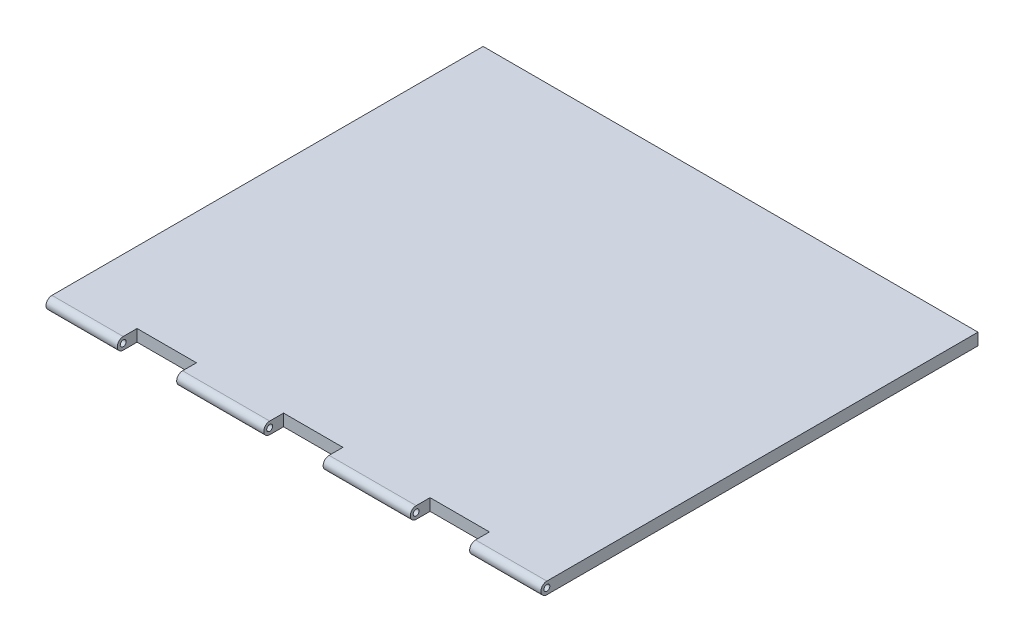
ISO-10303-21;
HEADER;
FILE_DESCRIPTION(('STEP AP214'),'2;1');
FILE_NAME('part.step','',(''),(''),'','','');
FILE_SCHEMA(('AUTOMOTIVE_DESIGN { 1 0 10303 214 1 1 1 1 }'));
ENDSEC;
DATA;
#1=APPLICATION_CONTEXT('core data for automotive mechanical design processes');
#2=APPLICATION_PROTOCOL_DEFINITION('international standard','automotive_design',2000,#1);
#3=PRODUCT_CONTEXT('',#1,'mechanical');
#4=PRODUCT('Part','Part','',(#3));
#5=PRODUCT_RELATED_PRODUCT_CATEGORY('part','',(#4));
#6=PRODUCT_DEFINITION_FORMATION('','',#4);
#7=PRODUCT_DEFINITION_CONTEXT('part definition',#1,'design');
#8=PRODUCT_DEFINITION('design','',#6,#7);
#9=PRODUCT_DEFINITION_SHAPE('','',#8);
#10=(LENGTH_UNIT() NAMED_UNIT(*) SI_UNIT(.MILLI.,.METRE.));
#11=(NAMED_UNIT(*) PLANE_ANGLE_UNIT() SI_UNIT($,.RADIAN.));
#12=(NAMED_UNIT(*) SI_UNIT($,.STERADIAN.) SOLID_ANGLE_UNIT());
#13=UNCERTAINTY_MEASURE_WITH_UNIT(LENGTH_MEASURE(1.E-05),#10,'distance_accuracy_value','');
#14=(GEOMETRIC_REPRESENTATION_CONTEXT(3) GLOBAL_UNCERTAINTY_ASSIGNED_CONTEXT((#13)) GLOBAL_UNIT_ASSIGNED_CONTEXT((#10,
#11,#12)) REPRESENTATION_CONTEXT('',''));
#15=CARTESIAN_POINT('',(0.,0.,0.));
#16=DIRECTION('',(0.,0.,1.));
#17=DIRECTION('',(1.,0.,0.));
#18=AXIS2_PLACEMENT_3D('',#15,#16,#17);
#19=CARTESIAN_POINT('',(-93.9597315436242,3.,-64.3875838926174));
#20=DIRECTION('',(1.,0.,0.));
#21=DIRECTION('',(0.,0.,-1.));
#22=AXIS2_PLACEMENT_3D('',#19,#20,#21);
#23=PLANE('',#22);
#24=CARTESIAN_POINT('',(-93.9597315436242,0.,153.412416107383));
#25=DIRECTION('',(-1.,0.,0.));
#26=DIRECTION('',(0.,0.,1.));
#27=AXIS2_PLACEMENT_3D('',#24,#25,#26);
#28=CIRCLE('',#27,1.5);
#29=CARTESIAN_POINT('',(-93.9597315436242,0.,154.912416107383));
#30=VERTEX_POINT('',#29);
#31=EDGE_CURVE('E329',#30,#30,#28,.T.);
#32=ORIENTED_EDGE('',*,*,#31,.F.);
#33=EDGE_LOOP('',(#32));
#34=FACE_BOUND('',#33,.T.);
#35=DIRECTION('',(0.,0.,1.));
#36=VECTOR('',#35,1.);
#37=CARTESIAN_POINT('',(-93.9597315436242,-3.,-64.3875838926174));
#38=LINE('',#37,#36);
#39=CARTESIAN_POINT('',(-93.9597315436242,-3.,-64.3875838926174));
#40=VERTEX_POINT('',#39);
#41=CARTESIAN_POINT('',(-93.9597315436242,-3.,153.412416107383));
#42=VERTEX_POINT('',#41);
#43=EDGE_CURVE('E216',#40,#42,#38,.T.);
#44=ORIENTED_EDGE('',*,*,#43,.T.);
#45=CARTESIAN_POINT('',(-93.9597315436242,0.,153.412416107383));
#46=DIRECTION('',(-1.,0.,0.));
#47=DIRECTION('',(0.,0.,1.));
#48=AXIS2_PLACEMENT_3D('',#45,#46,#47);
#49=CIRCLE('',#48,3.);
#50=CARTESIAN_POINT('',(-93.9597315436242,3.,153.412416107383));
#51=VERTEX_POINT('',#50);
#52=EDGE_CURVE('E202',#42,#51,#49,.T.);
#53=ORIENTED_EDGE('',*,*,#52,.T.);
#54=DIRECTION('',(0.,0.,1.));
#55=VECTOR('',#54,1.);
#56=CARTESIAN_POINT('',(-93.9597315436242,3.,-64.3875838926174));
#57=LINE('',#56,#55);
#58=CARTESIAN_POINT('',(-93.9597315436242,3.,-64.3875838926174));
#59=VERTEX_POINT('',#58);
#60=EDGE_CURVE('E218',#59,#51,#57,.T.);
#61=ORIENTED_EDGE('',*,*,#60,.F.);
#62=DIRECTION('',(0.,-1.,0.));
#63=VECTOR('',#62,1.);
#64=CARTESIAN_POINT('',(-93.9597315436242,3.,-64.3875838926174));
#65=LINE('',#64,#63);
#66=EDGE_CURVE('E225',#59,#40,#65,.T.);
#67=ORIENTED_EDGE('',*,*,#66,.T.);
#68=EDGE_LOOP('',(#44,#53,#61,#67));
#69=FACE_BOUND('',#68,.T.);
#70=ADVANCED_FACE('F81',(#34,#69),#23,.F.);
#71=CARTESIAN_POINT('',(156.040268456376,3.,-64.3875838926174));
#72=DIRECTION('',(-1.,0.,0.));
#73=DIRECTION('',(0.,0.,1.));
#74=AXIS2_PLACEMENT_3D('',#71,#72,#73);
#75=PLANE('',#74);
#76=CARTESIAN_POINT('',(156.040268456376,0.,153.412416107383));
#77=DIRECTION('',(-1.,0.,0.));
#78=DIRECTION('',(0.,0.,1.));
#79=AXIS2_PLACEMENT_3D('',#76,#77,#78);
#80=CIRCLE('',#79,1.5);
#81=CARTESIAN_POINT('',(156.040268456376,0.,154.912416107383));
#82=VERTEX_POINT('',#81);
#83=EDGE_CURVE('E235',#82,#82,#80,.T.);
#84=ORIENTED_EDGE('',*,*,#83,.T.);
#85=EDGE_LOOP('',(#84));
#86=FACE_BOUND('',#85,.T.);
#87=CARTESIAN_POINT('',(156.040268456376,0.,153.412416107383));
#88=DIRECTION('',(-1.,0.,0.));
#89=DIRECTION('',(0.,0.,1.));
#90=AXIS2_PLACEMENT_3D('',#87,#88,#89);
#91=CIRCLE('',#90,3.);
#92=CARTESIAN_POINT('',(156.040268456376,-3.,153.412416107383));
#93=VERTEX_POINT('',#92);
#94=CARTESIAN_POINT('',(156.040268456376,3.,153.412416107383));
#95=VERTEX_POINT('',#94);
#96=EDGE_CURVE('E193',#93,#95,#91,.T.);
#97=ORIENTED_EDGE('',*,*,#96,.F.);
#98=DIRECTION('',(0.,0.,-1.));
#99=VECTOR('',#98,1.);
#100=CARTESIAN_POINT('',(156.040268456376,-3.,-64.3875838926174));
#101=LINE('',#100,#99);
#102=CARTESIAN_POINT('',(156.040268456376,-3.,-64.3875838926174));
#103=VERTEX_POINT('',#102);
#104=EDGE_CURVE('E198',#93,#103,#101,.T.);
#105=ORIENTED_EDGE('',*,*,#104,.T.);
#106=DIRECTION('',(0.,-1.,0.));
#107=VECTOR('',#106,1.);
#108=CARTESIAN_POINT('',(156.040268456376,3.,-64.3875838926174));
#109=LINE('',#108,#107);
#110=CARTESIAN_POINT('',(156.040268456376,3.,-64.3875838926174));
#111=VERTEX_POINT('',#110);
#112=EDGE_CURVE('E228',#111,#103,#109,.T.);
#113=ORIENTED_EDGE('',*,*,#112,.F.);
#114=DIRECTION('',(0.,0.,-1.));
#115=VECTOR('',#114,1.);
#116=CARTESIAN_POINT('',(156.040268456376,3.,-64.3875838926174));
#117=LINE('',#116,#115);
#118=EDGE_CURVE('E200',#95,#111,#117,.T.);
#119=ORIENTED_EDGE('',*,*,#118,.F.);
#120=EDGE_LOOP('',(#97,#105,#113,#119));
#121=FACE_BOUND('',#120,.T.);
#122=ADVANCED_FACE('F195',(#86,#121),#75,.F.);
#123=CARTESIAN_POINT('',(90.0402684563758,-3.001,156.412416107383));
#124=DIRECTION('',(-1.,0.,0.));
#125=DIRECTION('',(0.,0.,1.));
#126=AXIS2_PLACEMENT_3D('',#123,#124,#125);
#127=PLANE('',#126);
#128=CARTESIAN_POINT('',(90.0402684563758,0.,153.412416107383));
#129=DIRECTION('',(-1.,0.,0.));
#130=DIRECTION('',(0.,0.,1.));
#131=AXIS2_PLACEMENT_3D('',#128,#129,#130);
#132=CIRCLE('',#131,1.5);
#133=CARTESIAN_POINT('',(90.0402684563758,0.,154.912416107383));
#134=VERTEX_POINT('',#133);
#135=EDGE_CURVE('E345',#134,#134,#132,.T.);
#136=ORIENTED_EDGE('',*,*,#135,.T.);
#137=EDGE_LOOP('',(#136));
#138=FACE_BOUND('',#137,.T.);
#139=CARTESIAN_POINT('',(90.0402684563758,0.,153.412416107383));
#140=DIRECTION('',(-1.,0.,0.));
#141=DIRECTION('',(0.,0.,1.));
#142=AXIS2_PLACEMENT_3D('',#139,#140,#141);
#143=CIRCLE('',#142,3.);
#144=CARTESIAN_POINT('',(90.0402684563758,-3.,153.412416107383));
#145=VERTEX_POINT('',#144);
#146=CARTESIAN_POINT('',(90.0402684563758,3.,153.412416107383));
#147=VERTEX_POINT('',#146);
#148=EDGE_CURVE('E299',#145,#147,#143,.T.);
#149=ORIENTED_EDGE('',*,*,#148,.F.);
#150=DIRECTION('',(0.,0.,-1.));
#151=VECTOR('',#150,1.);
#152=CARTESIAN_POINT('',(90.0402684563758,-3.,156.412416107383));
#153=LINE('',#152,#151);
#154=CARTESIAN_POINT('',(90.0402684563758,-3.,146.412416107383));
#155=VERTEX_POINT('',#154);
#156=EDGE_CURVE('E312',#145,#155,#153,.T.);
#157=ORIENTED_EDGE('',*,*,#156,.T.);
#158=DIRECTION('',(0.,1.,0.));
#159=VECTOR('',#158,1.);
#160=CARTESIAN_POINT('',(90.0402684563758,-3.001,146.412416107383));
#161=LINE('',#160,#159);
#162=CARTESIAN_POINT('',(90.0402684563758,3.,146.412416107383));
#163=VERTEX_POINT('',#162);
#164=EDGE_CURVE('E298',#155,#163,#161,.T.);
#165=ORIENTED_EDGE('',*,*,#164,.T.);
#166=DIRECTION('',(0.,0.,1.));
#167=VECTOR('',#166,1.);
#168=CARTESIAN_POINT('',(90.0402684563758,3.,156.412416107383));
#169=LINE('',#168,#167);
#170=EDGE_CURVE('E303',#163,#147,#169,.T.);
#171=ORIENTED_EDGE('',*,*,#170,.T.);
#172=EDGE_LOOP('',(#149,#157,#165,#171));
#173=FACE_BOUND('',#172,.T.);
#174=ADVANCED_FACE('F362',(#138,#173),#127,.F.);
#175=CARTESIAN_POINT('',(120.040268456376,-3.001,156.412416107383));
#176=DIRECTION('',(1.,0.,0.));
#177=DIRECTION('',(0.,0.,-1.));
#178=AXIS2_PLACEMENT_3D('',#175,#176,#177);
#179=PLANE('',#178);
#180=CARTESIAN_POINT('',(120.040268456376,0.,153.412416107383));
#181=DIRECTION('',(1.,0.,0.));
#182=DIRECTION('',(0.,0.,-1.));
#183=AXIS2_PLACEMENT_3D('',#180,#181,#182);
#184=CIRCLE('',#183,1.5);
#185=CARTESIAN_POINT('',(120.040268456376,0.,151.912416107383));
#186=VERTEX_POINT('',#185);
#187=EDGE_CURVE('E342',#186,#186,#184,.T.);
#188=ORIENTED_EDGE('',*,*,#187,.T.);
#189=EDGE_LOOP('',(#188));
#190=FACE_BOUND('',#189,.T.);
#191=DIRECTION('',(0.,0.,1.));
#192=VECTOR('',#191,1.);
#193=CARTESIAN_POINT('',(120.040268456376,-3.,156.412416107383));
#194=LINE('',#193,#192);
#195=CARTESIAN_POINT('',(120.040268456376,-3.,146.412416107383));
#196=VERTEX_POINT('',#195);
#197=CARTESIAN_POINT('',(120.040268456376,-3.,153.412416107383));
#198=VERTEX_POINT('',#197);
#199=EDGE_CURVE('E296',#196,#198,#194,.T.);
#200=ORIENTED_EDGE('',*,*,#199,.T.);
#201=CARTESIAN_POINT('',(120.040268456376,0.,153.412416107383));
#202=DIRECTION('',(1.,0.,0.));
#203=DIRECTION('',(0.,0.,-1.));
#204=AXIS2_PLACEMENT_3D('',#201,#202,#203);
#205=CIRCLE('',#204,3.);
#206=CARTESIAN_POINT('',(120.040268456376,3.,153.412416107383));
#207=VERTEX_POINT('',#206);
#208=EDGE_CURVE('E207',#207,#198,#205,.T.);
#209=ORIENTED_EDGE('',*,*,#208,.F.);
#210=DIRECTION('',(0.,0.,-1.));
#211=VECTOR('',#210,1.);
#212=CARTESIAN_POINT('',(120.040268456376,3.,156.412416107383));
#213=LINE('',#212,#211);
#214=CARTESIAN_POINT('',(120.040268456376,3.,146.412416107383));
#215=VERTEX_POINT('',#214);
#216=EDGE_CURVE('E310',#207,#215,#213,.T.);
#217=ORIENTED_EDGE('',*,*,#216,.T.);
#218=DIRECTION('',(0.,1.,0.));
#219=VECTOR('',#218,1.);
#220=CARTESIAN_POINT('',(120.040268456376,-3.001,146.412416107383));
#221=LINE('',#220,#219);
#222=EDGE_CURVE('E300',#196,#215,#221,.T.);
#223=ORIENTED_EDGE('',*,*,#222,.F.);
#224=EDGE_LOOP('',(#200,#209,#217,#223));
#225=FACE_BOUND('',#224,.T.);
#226=ADVANCED_FACE('F370',(#190,#225),#179,.F.);
#227=CARTESIAN_POINT('',(16.0402684563758,-3.001,156.412416107383));
#228=DIRECTION('',(-1.,0.,0.));
#229=DIRECTION('',(0.,0.,1.));
#230=AXIS2_PLACEMENT_3D('',#227,#228,#229);
#231=PLANE('',#230);
#232=CARTESIAN_POINT('',(16.0402684563758,0.,153.412416107383));
#233=DIRECTION('',(-1.,0.,0.));
#234=DIRECTION('',(0.,0.,1.));
#235=AXIS2_PLACEMENT_3D('',#232,#233,#234);
#236=CIRCLE('',#235,1.5);
#237=CARTESIAN_POINT('',(16.0402684563758,0.,154.912416107383));
#238=VERTEX_POINT('',#237);
#239=EDGE_CURVE('E339',#238,#238,#236,.T.);
#240=ORIENTED_EDGE('',*,*,#239,.T.);
#241=EDGE_LOOP('',(#240));
#242=FACE_BOUND('',#241,.T.);
#243=CARTESIAN_POINT('',(16.0402684563758,0.,153.412416107383));
#244=DIRECTION('',(-1.,0.,0.));
#245=DIRECTION('',(0.,0.,1.));
#246=AXIS2_PLACEMENT_3D('',#243,#244,#245);
#247=CIRCLE('',#246,3.);
#248=CARTESIAN_POINT('',(16.0402684563758,-3.,153.412416107383));
#249=VERTEX_POINT('',#248);
#250=CARTESIAN_POINT('',(16.0402684563758,3.,153.412416107383));
#251=VERTEX_POINT('',#250);
#252=EDGE_CURVE('E351',#249,#251,#247,.T.);
#253=ORIENTED_EDGE('',*,*,#252,.F.);
#254=DIRECTION('',(0.,0.,-1.));
#255=VECTOR('',#254,1.);
#256=CARTESIAN_POINT('',(16.0402684563758,-3.,156.412416107383));
#257=LINE('',#256,#255);
#258=CARTESIAN_POINT('',(16.0402684563758,-3.,146.412416107383));
#259=VERTEX_POINT('',#258);
#260=EDGE_CURVE('E249',#249,#259,#257,.T.);
#261=ORIENTED_EDGE('',*,*,#260,.T.);
#262=DIRECTION('',(0.,1.,0.));
#263=VECTOR('',#262,1.);
#264=CARTESIAN_POINT('',(16.0402684563758,-3.001,146.412416107383));
#265=LINE('',#264,#263);
#266=CARTESIAN_POINT('',(16.0402684563758,3.,146.412416107383));
#267=VERTEX_POINT('',#266);
#268=EDGE_CURVE('E280',#259,#267,#265,.T.);
#269=ORIENTED_EDGE('',*,*,#268,.T.);
#270=DIRECTION('',(0.,0.,1.));
#271=VECTOR('',#270,1.);
#272=CARTESIAN_POINT('',(16.0402684563758,3.,156.412416107383));
#273=LINE('',#272,#271);
#274=EDGE_CURVE('E285',#267,#251,#273,.T.);
#275=ORIENTED_EDGE('',*,*,#274,.T.);
#276=EDGE_LOOP('',(#253,#261,#269,#275));
#277=FACE_BOUND('',#276,.T.);
#278=ADVANCED_FACE('F381',(#242,#277),#231,.F.);
#279=CARTESIAN_POINT('',(46.0402684563758,-3.001,156.412416107383));
#280=DIRECTION('',(1.,0.,0.));
#281=DIRECTION('',(0.,0.,-1.));
#282=AXIS2_PLACEMENT_3D('',#279,#280,#281);
#283=PLANE('',#282);
#284=CARTESIAN_POINT('',(46.0402684563758,0.,153.412416107383));
#285=DIRECTION('',(1.,0.,0.));
#286=DIRECTION('',(0.,0.,-1.));
#287=AXIS2_PLACEMENT_3D('',#284,#285,#286);
#288=CIRCLE('',#287,1.5);
#289=CARTESIAN_POINT('',(46.0402684563758,0.,154.912416107383));
#290=VERTEX_POINT('',#289);
#291=EDGE_CURVE('E336',#290,#290,#288,.T.);
#292=ORIENTED_EDGE('',*,*,#291,.T.);
#293=EDGE_LOOP('',(#292));
#294=FACE_BOUND('',#293,.T.);
#295=DIRECTION('',(0.,0.,1.));
#296=VECTOR('',#295,1.);
#297=CARTESIAN_POINT('',(46.0402684563758,-3.,156.412416107383));
#298=LINE('',#297,#296);
#299=CARTESIAN_POINT('',(46.0402684563758,-3.,146.412416107383));
#300=VERTEX_POINT('',#299);
#301=CARTESIAN_POINT('',(46.0402684563758,-3.,153.412416107383));
#302=VERTEX_POINT('',#301);
#303=EDGE_CURVE('E277',#300,#302,#298,.T.);
#304=ORIENTED_EDGE('',*,*,#303,.T.);
#305=CARTESIAN_POINT('',(46.0402684563758,0.,153.412416107383));
#306=DIRECTION('',(1.,0.,0.));
#307=DIRECTION('',(0.,0.,-1.));
#308=AXIS2_PLACEMENT_3D('',#305,#306,#307);
#309=CIRCLE('',#308,3.);
#310=CARTESIAN_POINT('',(46.0402684563758,3.,153.412416107383));
#311=VERTEX_POINT('',#310);
#312=EDGE_CURVE('E349',#311,#302,#309,.T.);
#313=ORIENTED_EDGE('',*,*,#312,.F.);
#314=DIRECTION('',(0.,0.,-1.));
#315=VECTOR('',#314,1.);
#316=CARTESIAN_POINT('',(46.0402684563758,3.,156.412416107383));
#317=LINE('',#316,#315);
#318=CARTESIAN_POINT('',(46.0402684563758,3.,146.412416107383));
#319=VERTEX_POINT('',#318);
#320=EDGE_CURVE('E292',#311,#319,#317,.T.);
#321=ORIENTED_EDGE('',*,*,#320,.T.);
#322=DIRECTION('',(0.,1.,0.));
#323=VECTOR('',#322,1.);
#324=CARTESIAN_POINT('',(46.0402684563758,-3.001,146.412416107383));
#325=LINE('',#324,#323);
#326=EDGE_CURVE('E282',#300,#319,#325,.T.);
#327=ORIENTED_EDGE('',*,*,#326,.F.);
#328=EDGE_LOOP('',(#304,#313,#321,#327));
#329=FACE_BOUND('',#328,.T.);
#330=ADVANCED_FACE('F374',(#294,#329),#283,.F.);
#331=CARTESIAN_POINT('',(-27.9597315436242,-3.001,156.412416107383));
#332=DIRECTION('',(1.,0.,0.));
#333=DIRECTION('',(0.,0.,-1.));
#334=AXIS2_PLACEMENT_3D('',#331,#332,#333);
#335=PLANE('',#334);
#336=CARTESIAN_POINT('',(-27.9597315436242,0.,153.412416107383));
#337=DIRECTION('',(1.,0.,0.));
#338=DIRECTION('',(0.,0.,-1.));
#339=AXIS2_PLACEMENT_3D('',#336,#337,#338);
#340=CIRCLE('',#339,1.5);
#341=CARTESIAN_POINT('',(-27.9597315436242,0.,154.912416107383));
#342=VERTEX_POINT('',#341);
#343=EDGE_CURVE('E234',#342,#342,#340,.T.);
#344=ORIENTED_EDGE('',*,*,#343,.T.);
#345=EDGE_LOOP('',(#344));
#346=FACE_BOUND('',#345,.T.);
#347=DIRECTION('',(0.,0.,1.));
#348=VECTOR('',#347,1.);
#349=CARTESIAN_POINT('',(-27.9597315436242,-3.,156.412416107383));
#350=LINE('',#349,#348);
#351=CARTESIAN_POINT('',(-27.9597315436242,-3.,146.412416107383));
#352=VERTEX_POINT('',#351);
#353=CARTESIAN_POINT('',(-27.9597315436242,-3.,153.412416107383));
#354=VERTEX_POINT('',#353);
#355=EDGE_CURVE('E247',#352,#354,#350,.T.);
#356=ORIENTED_EDGE('',*,*,#355,.T.);
#357=CARTESIAN_POINT('',(-27.9597315436242,0.,153.412416107383));
#358=DIRECTION('',(1.,0.,0.));
#359=DIRECTION('',(0.,0.,-1.));
#360=AXIS2_PLACEMENT_3D('',#357,#358,#359);
#361=CIRCLE('',#360,3.);
#362=CARTESIAN_POINT('',(-27.9597315436242,3.,153.412416107383));
#363=VERTEX_POINT('',#362);
#364=EDGE_CURVE('E254',#363,#354,#361,.T.);
#365=ORIENTED_EDGE('',*,*,#364,.F.);
#366=DIRECTION('',(0.,0.,-1.));
#367=VECTOR('',#366,1.);
#368=CARTESIAN_POINT('',(-27.9597315436242,3.,156.412416107383));
#369=LINE('',#368,#367);
#370=CARTESIAN_POINT('',(-27.9597315436242,3.,146.412416107383));
#371=VERTEX_POINT('',#370);
#372=EDGE_CURVE('E259',#363,#371,#369,.T.);
#373=ORIENTED_EDGE('',*,*,#372,.T.);
#374=DIRECTION('',(0.,1.,0.));
#375=VECTOR('',#374,1.);
#376=CARTESIAN_POINT('',(-27.9597315436242,-3.001,146.412416107383));
#377=LINE('',#376,#375);
#378=EDGE_CURVE('E257',#352,#371,#377,.T.);
#379=ORIENTED_EDGE('',*,*,#378,.F.);
#380=EDGE_LOOP('',(#356,#365,#373,#379));
#381=FACE_BOUND('',#380,.T.);
#382=ADVANCED_FACE('F253',(#346,#381),#335,.F.);
#383=CARTESIAN_POINT('',(-57.9597315436242,-3.001,156.412416107383));
#384=DIRECTION('',(-1.,0.,0.));
#385=DIRECTION('',(0.,0.,1.));
#386=AXIS2_PLACEMENT_3D('',#383,#384,#385);
#387=PLANE('',#386);
#388=CARTESIAN_POINT('',(-57.9597315436242,0.,153.412416107383));
#389=DIRECTION('',(-1.,0.,0.));
#390=DIRECTION('',(0.,0.,1.));
#391=AXIS2_PLACEMENT_3D('',#388,#389,#390);
#392=CIRCLE('',#391,1.5);
#393=CARTESIAN_POINT('',(-57.9597315436242,0.,154.912416107383));
#394=VERTEX_POINT('',#393);
#395=EDGE_CURVE('E232',#394,#394,#392,.T.);
#396=ORIENTED_EDGE('',*,*,#395,.T.);
#397=EDGE_LOOP('',(#396));
#398=FACE_BOUND('',#397,.T.);
#399=CARTESIAN_POINT('',(-57.9597315436242,0.,153.412416107383));
#400=DIRECTION('',(-1.,0.,0.));
#401=DIRECTION('',(0.,0.,1.));
#402=AXIS2_PLACEMENT_3D('',#399,#400,#401);
#403=CIRCLE('',#402,3.);
#404=CARTESIAN_POINT('',(-57.9597315436242,-3.,153.412416107383));
#405=VERTEX_POINT('',#404);
#406=CARTESIAN_POINT('',(-57.9597315436242,3.,153.412416107383));
#407=VERTEX_POINT('',#406);
#408=EDGE_CURVE('E231',#405,#407,#403,.T.);
#409=ORIENTED_EDGE('',*,*,#408,.F.);
#410=DIRECTION('',(0.,0.,-1.));
#411=VECTOR('',#410,1.);
#412=CARTESIAN_POINT('',(-57.9597315436242,-3.,156.412416107383));
#413=LINE('',#412,#411);
#414=CARTESIAN_POINT('',(-57.9597315436242,-3.,146.412416107383));
#415=VERTEX_POINT('',#414);
#416=EDGE_CURVE('E260',#405,#415,#413,.T.);
#417=ORIENTED_EDGE('',*,*,#416,.T.);
#418=DIRECTION('',(0.,1.,0.));
#419=VECTOR('',#418,1.);
#420=CARTESIAN_POINT('',(-57.9597315436242,-3.001,146.412416107383));
#421=LINE('',#420,#419);
#422=CARTESIAN_POINT('',(-57.9597315436242,3.,146.412416107383));
#423=VERTEX_POINT('',#422);
#424=EDGE_CURVE('E273',#415,#423,#421,.T.);
#425=ORIENTED_EDGE('',*,*,#424,.T.);
#426=DIRECTION('',(0.,0.,1.));
#427=VECTOR('',#426,1.);
#428=CARTESIAN_POINT('',(-57.9597315436242,3.,156.412416107383));
#429=LINE('',#428,#427);
#430=EDGE_CURVE('E270',#423,#407,#429,.T.);
#431=ORIENTED_EDGE('',*,*,#430,.T.);
#432=EDGE_LOOP('',(#409,#417,#425,#431));
#433=FACE_BOUND('',#432,.T.);
#434=ADVANCED_FACE('F387',(#398,#433),#387,.F.);
#435=CARTESIAN_POINT('',(-93.9597315436242,3.,-64.3875838926174));
#436=DIRECTION('',(0.,0.,1.));
#437=DIRECTION('',(1.,0.,0.));
#438=AXIS2_PLACEMENT_3D('',#435,#436,#437);
#439=PLANE('',#438);
#440=DIRECTION('',(-1.,0.,0.));
#441=VECTOR('',#440,1.);
#442=CARTESIAN_POINT('',(-93.9597315436242,-3.,-64.3875838926174));
#443=LINE('',#442,#441);
#444=EDGE_CURVE('E215',#103,#40,#443,.T.);
#445=ORIENTED_EDGE('',*,*,#444,.T.);
#446=ORIENTED_EDGE('',*,*,#66,.F.);
#447=DIRECTION('',(-1.,0.,0.));
#448=VECTOR('',#447,1.);
#449=CARTESIAN_POINT('',(-93.9597315436242,3.,-64.3875838926174));
#450=LINE('',#449,#448);
#451=EDGE_CURVE('E229',#111,#59,#450,.T.);
#452=ORIENTED_EDGE('',*,*,#451,.F.);
#453=ORIENTED_EDGE('',*,*,#112,.T.);
#454=EDGE_LOOP('',(#445,#446,#452,#453));
#455=FACE_BOUND('',#454,.T.);
#456=ADVANCED_FACE('F323',(#455),#439,.F.);
#457=CARTESIAN_POINT('',(0.,3.,0.));
#458=DIRECTION('',(0.,1.,0.));
#459=DIRECTION('',(0.,0.,1.));
#460=AXIS2_PLACEMENT_3D('',#457,#458,#459);
#461=PLANE('',#460);
#462=DIRECTION('',(-1.,0.,0.));
#463=VECTOR('',#462,1.);
#464=CARTESIAN_POINT('',(156.040268456376,3.,153.412416107383));
#465=LINE('',#464,#463);
#466=EDGE_CURVE('E96',#95,#207,#465,.T.);
#467=ORIENTED_EDGE('',*,*,#466,.F.);
#468=ORIENTED_EDGE('',*,*,#118,.T.);
#469=ORIENTED_EDGE('',*,*,#451,.T.);
#470=ORIENTED_EDGE('',*,*,#60,.T.);
#471=EDGE_CURVE('E201',#407,#51,#465,.T.);
#472=ORIENTED_EDGE('',*,*,#471,.F.);
#473=ORIENTED_EDGE('',*,*,#430,.F.);
#474=DIRECTION('',(-1.,0.,0.));
#475=VECTOR('',#474,1.);
#476=CARTESIAN_POINT('',(-27.9597315436242,3.,146.412416107383));
#477=LINE('',#476,#475);
#478=EDGE_CURVE('E262',#371,#423,#477,.T.);
#479=ORIENTED_EDGE('',*,*,#478,.F.);
#480=ORIENTED_EDGE('',*,*,#372,.F.);
#481=EDGE_CURVE('E361',#251,#363,#465,.T.);
#482=ORIENTED_EDGE('',*,*,#481,.F.);
#483=ORIENTED_EDGE('',*,*,#274,.F.);
#484=DIRECTION('',(-1.,0.,0.));
#485=VECTOR('',#484,1.);
#486=CARTESIAN_POINT('',(46.0402684563758,3.,146.412416107383));
#487=LINE('',#486,#485);
#488=EDGE_CURVE('E289',#319,#267,#487,.T.);
#489=ORIENTED_EDGE('',*,*,#488,.F.);
#490=ORIENTED_EDGE('',*,*,#320,.F.);
#491=EDGE_CURVE('E104',#147,#311,#465,.T.);
#492=ORIENTED_EDGE('',*,*,#491,.F.);
#493=ORIENTED_EDGE('',*,*,#170,.F.);
#494=DIRECTION('',(-1.,0.,0.));
#495=VECTOR('',#494,1.);
#496=CARTESIAN_POINT('',(120.040268456376,3.,146.412416107383));
#497=LINE('',#496,#495);
#498=EDGE_CURVE('E307',#215,#163,#497,.T.);
#499=ORIENTED_EDGE('',*,*,#498,.F.);
#500=ORIENTED_EDGE('',*,*,#216,.F.);
#501=EDGE_LOOP('',(#467,#468,#469,#470,#472,#473,#479,#480,#482,#483,#489,#490,#492,#493,#499,#500));
#502=FACE_BOUND('',#501,.T.);
#503=ADVANCED_FACE('F320',(#502),#461,.T.);
#504=CARTESIAN_POINT('',(0.,-3.,0.));
#505=DIRECTION('',(0.,1.,0.));
#506=DIRECTION('',(0.,0.,1.));
#507=AXIS2_PLACEMENT_3D('',#504,#505,#506);
#508=PLANE('',#507);
#509=ORIENTED_EDGE('',*,*,#104,.F.);
#510=DIRECTION('',(-1.,0.,0.));
#511=VECTOR('',#510,1.);
#512=CARTESIAN_POINT('',(156.040268456376,-3.,153.412416107383));
#513=LINE('',#512,#511);
#514=EDGE_CURVE('E205',#93,#198,#513,.T.);
#515=ORIENTED_EDGE('',*,*,#514,.T.);
#516=ORIENTED_EDGE('',*,*,#199,.F.);
#517=DIRECTION('',(1.,0.,0.));
#518=VECTOR('',#517,1.);
#519=CARTESIAN_POINT('',(120.040268456376,-3.,146.412416107383));
#520=LINE('',#519,#518);
#521=EDGE_CURVE('E281',#155,#196,#520,.T.);
#522=ORIENTED_EDGE('',*,*,#521,.F.);
#523=ORIENTED_EDGE('',*,*,#156,.F.);
#524=DIRECTION('',(-1.,0.,0.));
#525=VECTOR('',#524,1.);
#526=CARTESIAN_POINT('',(156.040268456376,-3.,153.412416107383));
#527=LINE('',#526,#525);
#528=EDGE_CURVE('E12',#145,#302,#527,.T.);
#529=ORIENTED_EDGE('',*,*,#528,.T.);
#530=ORIENTED_EDGE('',*,*,#303,.F.);
#531=DIRECTION('',(1.,0.,0.));
#532=VECTOR('',#531,1.);
#533=CARTESIAN_POINT('',(46.0402684563758,-3.,146.412416107383));
#534=LINE('',#533,#532);
#535=EDGE_CURVE('E264',#259,#300,#534,.T.);
#536=ORIENTED_EDGE('',*,*,#535,.F.);
#537=ORIENTED_EDGE('',*,*,#260,.F.);
#538=EDGE_CURVE('E89',#249,#354,#527,.T.);
#539=ORIENTED_EDGE('',*,*,#538,.T.);
#540=ORIENTED_EDGE('',*,*,#355,.F.);
#541=DIRECTION('',(1.,0.,0.));
#542=VECTOR('',#541,1.);
#543=CARTESIAN_POINT('',(-27.9597315436242,-3.,146.412416107383));
#544=LINE('',#543,#542);
#545=EDGE_CURVE('E221',#415,#352,#544,.T.);
#546=ORIENTED_EDGE('',*,*,#545,.F.);
#547=ORIENTED_EDGE('',*,*,#416,.F.);
#548=EDGE_CURVE('E84',#405,#42,#527,.T.);
#549=ORIENTED_EDGE('',*,*,#548,.T.);
#550=ORIENTED_EDGE('',*,*,#43,.F.);
#551=ORIENTED_EDGE('',*,*,#444,.F.);
#552=EDGE_LOOP('',(#509,#515,#516,#522,#523,#529,#530,#536,#537,#539,#540,#546,#547,#549,#550,#551));
#553=FACE_BOUND('',#552,.T.);
#554=ADVANCED_FACE('F213',(#553),#508,.F.);
#555=CARTESIAN_POINT('',(120.040268456376,-3.001,146.412416107383));
#556=DIRECTION('',(0.,0.,-1.));
#557=DIRECTION('',(-1.,0.,0.));
#558=AXIS2_PLACEMENT_3D('',#555,#556,#557);
#559=PLANE('',#558);
#560=ORIENTED_EDGE('',*,*,#521,.T.);
#561=ORIENTED_EDGE('',*,*,#222,.T.);
#562=ORIENTED_EDGE('',*,*,#498,.T.);
#563=ORIENTED_EDGE('',*,*,#164,.F.);
#564=EDGE_LOOP('',(#560,#561,#562,#563));
#565=FACE_BOUND('',#564,.T.);
#566=ADVANCED_FACE('F366',(#565),#559,.F.);
#567=CARTESIAN_POINT('',(46.0402684563758,-3.001,146.412416107383));
#568=DIRECTION('',(0.,0.,-1.));
#569=DIRECTION('',(-1.,0.,0.));
#570=AXIS2_PLACEMENT_3D('',#567,#568,#569);
#571=PLANE('',#570);
#572=ORIENTED_EDGE('',*,*,#535,.T.);
#573=ORIENTED_EDGE('',*,*,#326,.T.);
#574=ORIENTED_EDGE('',*,*,#488,.T.);
#575=ORIENTED_EDGE('',*,*,#268,.F.);
#576=EDGE_LOOP('',(#572,#573,#574,#575));
#577=FACE_BOUND('',#576,.T.);
#578=ADVANCED_FACE('F376',(#577),#571,.F.);
#579=CARTESIAN_POINT('',(-27.9597315436242,-3.001,146.412416107383));
#580=DIRECTION('',(0.,0.,-1.));
#581=DIRECTION('',(-1.,0.,0.));
#582=AXIS2_PLACEMENT_3D('',#579,#580,#581);
#583=PLANE('',#582);
#584=ORIENTED_EDGE('',*,*,#545,.T.);
#585=ORIENTED_EDGE('',*,*,#378,.T.);
#586=ORIENTED_EDGE('',*,*,#478,.T.);
#587=ORIENTED_EDGE('',*,*,#424,.F.);
#588=EDGE_LOOP('',(#584,#585,#586,#587));
#589=FACE_BOUND('',#588,.T.);
#590=ADVANCED_FACE('F390',(#589),#583,.F.);
#591=CARTESIAN_POINT('',(156.040268456376,0.,153.412416107383));
#592=DIRECTION('',(-1.,0.,0.));
#593=DIRECTION('',(0.,0.,1.));
#594=AXIS2_PLACEMENT_3D('',#591,#592,#593);
#595=CYLINDRICAL_SURFACE('',#594,1.5);
#596=ORIENTED_EDGE('',*,*,#31,.T.);
#597=EDGE_LOOP('',(#596));
#598=FACE_BOUND('',#597,.T.);
#599=ORIENTED_EDGE('',*,*,#395,.F.);
#600=EDGE_LOOP('',(#599));
#601=FACE_BOUND('',#600,.T.);
#602=ADVANCED_FACE('F392',(#598,#601),#595,.F.);
#603=CARTESIAN_POINT('',(156.040268456376,0.,153.412416107383));
#604=DIRECTION('',(-1.,0.,0.));
#605=DIRECTION('',(0.,0.,1.));
#606=AXIS2_PLACEMENT_3D('',#603,#604,#605);
#607=CYLINDRICAL_SURFACE('',#606,3.);
#608=ORIENTED_EDGE('',*,*,#408,.T.);
#609=ORIENTED_EDGE('',*,*,#471,.T.);
#610=ORIENTED_EDGE('',*,*,#52,.F.);
#611=ORIENTED_EDGE('',*,*,#548,.F.);
#612=EDGE_LOOP('',(#608,#609,#610,#611));
#613=FACE_BOUND('',#612,.T.);
#614=ADVANCED_FACE('F383',(#613),#607,.T.);
#615=CARTESIAN_POINT('',(-27.9597315436242,0.,154.912416107383));
#616=CARTESIAN_POINT('',(-27.5013982102909,0.,154.912416107383));
#617=CARTESIAN_POINT('',(-27.0430648769575,0.,154.912416107383));
#618=CARTESIAN_POINT('',(-26.1263982102909,0.,154.912416107383));
#619=CARTESIAN_POINT('',(-25.6680648769575,0.,154.912416107383));
#620=CARTESIAN_POINT('',(-24.7513982102909,0.,154.912416107383));
#621=CARTESIAN_POINT('',(-24.2930648769575,0.,154.912416107383));
#622=CARTESIAN_POINT('',(-23.3763982102909,0.,154.912416107383));
#623=CARTESIAN_POINT('',(-22.9180648769575,0.,154.912416107383));
#624=CARTESIAN_POINT('',(-22.0013982102909,0.,154.912416107383));
#625=CARTESIAN_POINT('',(-21.5430648769575,0.,154.912416107383));
#626=CARTESIAN_POINT('',(-20.6263982102909,0.,154.912416107383));
#627=CARTESIAN_POINT('',(-20.1680648769575,0.,154.912416107383));
#628=CARTESIAN_POINT('',(-19.2513982102909,0.,154.912416107383));
#629=CARTESIAN_POINT('',(-18.7930648769575,0.,154.912416107383));
#630=CARTESIAN_POINT('',(-17.8763982102909,0.,154.912416107383));
#631=CARTESIAN_POINT('',(-17.4180648769575,0.,154.912416107383));
#632=CARTESIAN_POINT('',(-16.5013982102909,0.,154.912416107383));
#633=CARTESIAN_POINT('',(-16.0430648769575,0.,154.912416107383));
#634=CARTESIAN_POINT('',(-15.1263982102909,0.,154.912416107383));
#635=CARTESIAN_POINT('',(-14.6680648769575,0.,154.912416107383));
#636=CARTESIAN_POINT('',(-13.7513982102909,0.,154.912416107383));
#637=CARTESIAN_POINT('',(-13.2930648769575,0.,154.912416107383));
#638=CARTESIAN_POINT('',(-12.3763982102909,0.,154.912416107383));
#639=CARTESIAN_POINT('',(-11.9180648769575,0.,154.912416107383));
#640=CARTESIAN_POINT('',(-11.0013982102909,0.,154.912416107383));
#641=CARTESIAN_POINT('',(-10.5430648769575,0.,154.912416107383));
#642=CARTESIAN_POINT('',(-9.62639821029086,0.,154.912416107383));
#643=CARTESIAN_POINT('',(-9.16806487695753,0.,154.912416107383));
#644=CARTESIAN_POINT('',(-8.25139821029086,0.,154.912416107383));
#645=CARTESIAN_POINT('',(-7.79306487695752,0.,154.912416107383));
#646=CARTESIAN_POINT('',(-6.87639821029086,0.,154.912416107383));
#647=CARTESIAN_POINT('',(-6.41806487695753,0.,154.912416107383));
#648=CARTESIAN_POINT('',(-5.50139821029087,0.,154.912416107383));
#649=CARTESIAN_POINT('',(-5.04306487695754,0.,154.912416107383));
#650=CARTESIAN_POINT('',(-4.12639821029087,0.,154.912416107383));
#651=CARTESIAN_POINT('',(-3.66806487695753,0.,154.912416107383));
#652=CARTESIAN_POINT('',(-2.75139821029087,0.,154.912416107383));
#653=CARTESIAN_POINT('',(-2.29306487695754,0.,154.912416107383));
#654=CARTESIAN_POINT('',(-1.37639821029087,0.,154.912416107383));
#655=CARTESIAN_POINT('',(-0.918064876957531,0.,154.912416107383));
#656=CARTESIAN_POINT('',(-0.00139821029086312,0.,154.912416107383));
#657=CARTESIAN_POINT('',(0.456935123042466,0.,154.912416107383));
#658=CARTESIAN_POINT('',(1.37360178970913,0.,154.912416107383));
#659=CARTESIAN_POINT('',(1.83193512304247,0.,154.912416107383));
#660=CARTESIAN_POINT('',(2.74860178970914,0.,154.912416107383));
#661=CARTESIAN_POINT('',(3.20693512304247,0.,154.912416107383));
#662=CARTESIAN_POINT('',(4.12360178970913,0.,154.912416107383));
#663=CARTESIAN_POINT('',(4.58193512304246,0.,154.912416107383));
#664=CARTESIAN_POINT('',(5.49860178970912,0.,154.912416107383));
#665=CARTESIAN_POINT('',(5.95693512304246,0.,154.912416107383));
#666=CARTESIAN_POINT('',(6.87360178970914,0.,154.912416107383));
#667=CARTESIAN_POINT('',(7.33193512304248,0.,154.912416107383));
#668=CARTESIAN_POINT('',(8.24860178970915,0.,154.912416107383));
#669=CARTESIAN_POINT('',(8.70693512304247,0.,154.912416107383));
#670=CARTESIAN_POINT('',(9.62360178970913,0.,154.912416107383));
#671=CARTESIAN_POINT('',(10.0819351230425,0.,154.912416107383));
#672=CARTESIAN_POINT('',(10.9986017897091,0.,154.912416107383));
#673=CARTESIAN_POINT('',(11.4569351230425,0.,154.912416107383));
#674=CARTESIAN_POINT('',(12.3736017897091,0.,154.912416107383));
#675=CARTESIAN_POINT('',(12.8319351230425,0.,154.912416107383));
#676=CARTESIAN_POINT('',(13.7486017897091,0.,154.912416107383));
#677=CARTESIAN_POINT('',(14.2069351230425,0.,154.912416107383));
#678=CARTESIAN_POINT('',(15.1236017897091,0.,154.912416107383));
#679=CARTESIAN_POINT('',(15.5819351230425,0.,154.912416107383));
#680=CARTESIAN_POINT('',(16.0402684563758,0.,154.912416107383));
#681=B_SPLINE_CURVE_WITH_KNOTS('',3,(#615,#616,#617,#618,#619,#620,#621,#622,#623,#624,#625,
#626,#627,#628,#629,#630,#631,#632,#633,#634,#635,#636,#637,#638,#639,#640,#641,#642,#643,#644,
#645,#646,#647,#648,#649,#650,#651,#652,#653,#654,#655,#656,#657,#658,#659,#660,#661,#662,#663,
#664,#665,#666,#667,#668,#669,#670,#671,#672,#673,#674,#675,#676,#677,#678,#679,#680),
.UNSPECIFIED.,.F.,.F.,(4,2,2,2,2,2,2,2,2,2,2,2,2,2,2,2,2,2,2,2,2,2,2,2,2,2,2,2,2,2,2,2,4),(0.,
1.37499999999999,2.75,4.12499999999999,5.50000000000001,6.87499999999999,8.25000000000001,
9.62499999999999,11.,12.375,13.75,15.125,16.5,17.875,19.25,20.625,22.,23.375,24.75,26.125,27.5,
28.875,30.25,31.625,33.,34.375,35.75,37.125,38.5,39.875,41.25,42.625,44.),.UNSPECIFIED.);
#682=EDGE_CURVE('BSEAM401',#342,#238,#681,.T.);
#683=ORIENTED_EDGE('',*,*,#343,.F.);
#684=ORIENTED_EDGE('',*,*,#239,.F.);
#685=ORIENTED_EDGE('',*,*,#682,.T.);
#686=ORIENTED_EDGE('',*,*,#682,.F.);
#687=EDGE_LOOP('',(#683,#685,#684,#686));
#688=FACE_BOUND('',#687,.T.);
#689=ADVANCED_FACE('F401',(#688),#595,.F.);
#690=ORIENTED_EDGE('',*,*,#252,.T.);
#691=ORIENTED_EDGE('',*,*,#481,.T.);
#692=ORIENTED_EDGE('',*,*,#364,.T.);
#693=ORIENTED_EDGE('',*,*,#538,.F.);
#694=EDGE_LOOP('',(#690,#691,#692,#693));
#695=FACE_BOUND('',#694,.T.);
#696=ADVANCED_FACE('F382',(#695),#607,.T.);
#697=CARTESIAN_POINT('',(46.0402684563758,0.,154.912416107383));
#698=CARTESIAN_POINT('',(46.4986017897091,0.,154.912416107383));
#699=CARTESIAN_POINT('',(46.9569351230425,0.,154.912416107383));
#700=CARTESIAN_POINT('',(47.8736017897091,0.,154.912416107383));
#701=CARTESIAN_POINT('',(48.3319351230425,0.,154.912416107383));
#702=CARTESIAN_POINT('',(49.2486017897091,0.,154.912416107383));
#703=CARTESIAN_POINT('',(49.7069351230425,0.,154.912416107383));
#704=CARTESIAN_POINT('',(50.6236017897091,0.,154.912416107383));
#705=CARTESIAN_POINT('',(51.0819351230425,0.,154.912416107383));
#706=CARTESIAN_POINT('',(51.9986017897091,0.,154.912416107383));
#707=CARTESIAN_POINT('',(52.4569351230425,0.,154.912416107383));
#708=CARTESIAN_POINT('',(53.3736017897091,0.,154.912416107383));
#709=CARTESIAN_POINT('',(53.8319351230425,0.,154.912416107383));
#710=CARTESIAN_POINT('',(54.7486017897091,0.,154.912416107383));
#711=CARTESIAN_POINT('',(55.2069351230425,0.,154.912416107383));
#712=CARTESIAN_POINT('',(56.1236017897091,0.,154.912416107383));
#713=CARTESIAN_POINT('',(56.5819351230425,0.,154.912416107383));
#714=CARTESIAN_POINT('',(57.4986017897091,0.,154.912416107383));
#715=CARTESIAN_POINT('',(57.9569351230425,0.,154.912416107383));
#716=CARTESIAN_POINT('',(58.8736017897091,0.,154.912416107383));
#717=CARTESIAN_POINT('',(59.3319351230425,0.,154.912416107383));
#718=CARTESIAN_POINT('',(60.2486017897091,0.,154.912416107383));
#719=CARTESIAN_POINT('',(60.7069351230425,0.,154.912416107383));
#720=CARTESIAN_POINT('',(61.6236017897091,0.,154.912416107383));
#721=CARTESIAN_POINT('',(62.0819351230424,0.,154.912416107383));
#722=CARTESIAN_POINT('',(62.9986017897091,0.,154.912416107383));
#723=CARTESIAN_POINT('',(63.4569351230425,0.,154.912416107383));
#724=CARTESIAN_POINT('',(64.3736017897091,0.,154.912416107383));
#725=CARTESIAN_POINT('',(64.8319351230425,0.,154.912416107383));
#726=CARTESIAN_POINT('',(65.7486017897091,0.,154.912416107383));
#727=CARTESIAN_POINT('',(66.2069351230424,0.,154.912416107383));
#728=CARTESIAN_POINT('',(67.1236017897091,0.,154.912416107383));
#729=CARTESIAN_POINT('',(67.5819351230424,0.,154.912416107383));
#730=CARTESIAN_POINT('',(68.4986017897091,0.,154.912416107383));
#731=CARTESIAN_POINT('',(68.9569351230424,0.,154.912416107383));
#732=CARTESIAN_POINT('',(69.8736017897091,0.,154.912416107383));
#733=CARTESIAN_POINT('',(70.3319351230425,0.,154.912416107383));
#734=CARTESIAN_POINT('',(71.2486017897091,0.,154.912416107383));
#735=CARTESIAN_POINT('',(71.7069351230425,0.,154.912416107383));
#736=CARTESIAN_POINT('',(72.6236017897091,0.,154.912416107383));
#737=CARTESIAN_POINT('',(73.0819351230425,0.,154.912416107383));
#738=CARTESIAN_POINT('',(73.9986017897091,0.,154.912416107383));
#739=CARTESIAN_POINT('',(74.4569351230425,0.,154.912416107383));
#740=CARTESIAN_POINT('',(75.3736017897091,0.,154.912416107383));
#741=CARTESIAN_POINT('',(75.8319351230424,0.,154.912416107383));
#742=CARTESIAN_POINT('',(76.7486017897091,0.,154.912416107383));
#743=CARTESIAN_POINT('',(77.2069351230424,0.,154.912416107383));
#744=CARTESIAN_POINT('',(78.1236017897091,0.,154.912416107383));
#745=CARTESIAN_POINT('',(78.5819351230424,0.,154.912416107383));
#746=CARTESIAN_POINT('',(79.4986017897091,0.,154.912416107383));
#747=CARTESIAN_POINT('',(79.9569351230424,0.,154.912416107383));
#748=CARTESIAN_POINT('',(80.8736017897091,0.,154.912416107383));
#749=CARTESIAN_POINT('',(81.3319351230424,0.,154.912416107383));
#750=CARTESIAN_POINT('',(82.2486017897091,0.,154.912416107383));
#751=CARTESIAN_POINT('',(82.7069351230424,0.,154.912416107383));
#752=CARTESIAN_POINT('',(83.6236017897091,0.,154.912416107383));
#753=CARTESIAN_POINT('',(84.0819351230424,0.,154.912416107383));
#754=CARTESIAN_POINT('',(84.9986017897091,0.,154.912416107383));
#755=CARTESIAN_POINT('',(85.4569351230425,0.,154.912416107383));
#756=CARTESIAN_POINT('',(86.3736017897091,0.,154.912416107383));
#757=CARTESIAN_POINT('',(86.8319351230425,0.,154.912416107383));
#758=CARTESIAN_POINT('',(87.7486017897091,0.,154.912416107383));
#759=CARTESIAN_POINT('',(88.2069351230424,0.,154.912416107383));
#760=CARTESIAN_POINT('',(89.1236017897091,0.,154.912416107383));
#761=CARTESIAN_POINT('',(89.5819351230424,0.,154.912416107383));
#762=CARTESIAN_POINT('',(90.0402684563758,0.,154.912416107383));
#763=B_SPLINE_CURVE_WITH_KNOTS('',3,(#697,#698,#699,#700,#701,#702,#703,#704,#705,#706,#707,
#708,#709,#710,#711,#712,#713,#714,#715,#716,#717,#718,#719,#720,#721,#722,#723,#724,#725,#726,
#727,#728,#729,#730,#731,#732,#733,#734,#735,#736,#737,#738,#739,#740,#741,#742,#743,#744,#745,
#746,#747,#748,#749,#750,#751,#752,#753,#754,#755,#756,#757,#758,#759,#760,#761,#762),
.UNSPECIFIED.,.F.,.F.,(4,2,2,2,2,2,2,2,2,2,2,2,2,2,2,2,2,2,2,2,2,2,2,2,2,2,2,2,2,2,2,2,4),(0.,
1.375,2.75,4.125,5.50000000000001,6.87499999999999,8.24999999999999,9.62499999999999,11.,12.375,
13.75,15.125,16.5,17.875,19.25,20.625,22.,23.375,24.75,26.125,27.5,28.875,30.25,31.625,33.,
34.375,35.75,37.125,38.5,39.875,41.25,42.625,44.),.UNSPECIFIED.);
#764=EDGE_CURVE('BSEAM400',#290,#134,#763,.T.);
#765=ORIENTED_EDGE('',*,*,#291,.F.);
#766=ORIENTED_EDGE('',*,*,#135,.F.);
#767=ORIENTED_EDGE('',*,*,#764,.T.);
#768=ORIENTED_EDGE('',*,*,#764,.F.);
#769=EDGE_LOOP('',(#765,#767,#766,#768));
#770=FACE_BOUND('',#769,.T.);
#771=ADVANCED_FACE('F400',(#770),#595,.F.);
#772=ORIENTED_EDGE('',*,*,#148,.T.);
#773=ORIENTED_EDGE('',*,*,#491,.T.);
#774=ORIENTED_EDGE('',*,*,#312,.T.);
#775=ORIENTED_EDGE('',*,*,#528,.F.);
#776=EDGE_LOOP('',(#772,#773,#774,#775));
#777=FACE_BOUND('',#776,.T.);
#778=ADVANCED_FACE('F354',(#777),#607,.T.);
#779=ORIENTED_EDGE('',*,*,#83,.F.);
#780=EDGE_LOOP('',(#779));
#781=FACE_BOUND('',#780,.T.);
#782=ORIENTED_EDGE('',*,*,#187,.F.);
#783=EDGE_LOOP('',(#782));
#784=FACE_BOUND('',#783,.T.);
#785=ADVANCED_FACE('F425',(#781,#784),#595,.F.);
#786=ORIENTED_EDGE('',*,*,#208,.T.);
#787=ORIENTED_EDGE('',*,*,#514,.F.);
#788=ORIENTED_EDGE('',*,*,#96,.T.);
#789=ORIENTED_EDGE('',*,*,#466,.T.);
#790=EDGE_LOOP('',(#786,#787,#788,#789));
#791=FACE_BOUND('',#790,.T.);
#792=ADVANCED_FACE('F206',(#791),#607,.T.);
#793=CLOSED_SHELL('',(#70,#122,#174,#226,#278,#330,#382,#434,#456,#503,#554,#566,#578,#590,#602,
#614,#689,#696,#771,#778,#785,#792));
#794=MANIFOLD_SOLID_BREP('B2',#793);
#795=ADVANCED_BREP_SHAPE_REPRESENTATION('',(#18,#794),#14);
#796=SHAPE_DEFINITION_REPRESENTATION(#9,#795);
ENDSEC;
END-ISO-10303-21;
